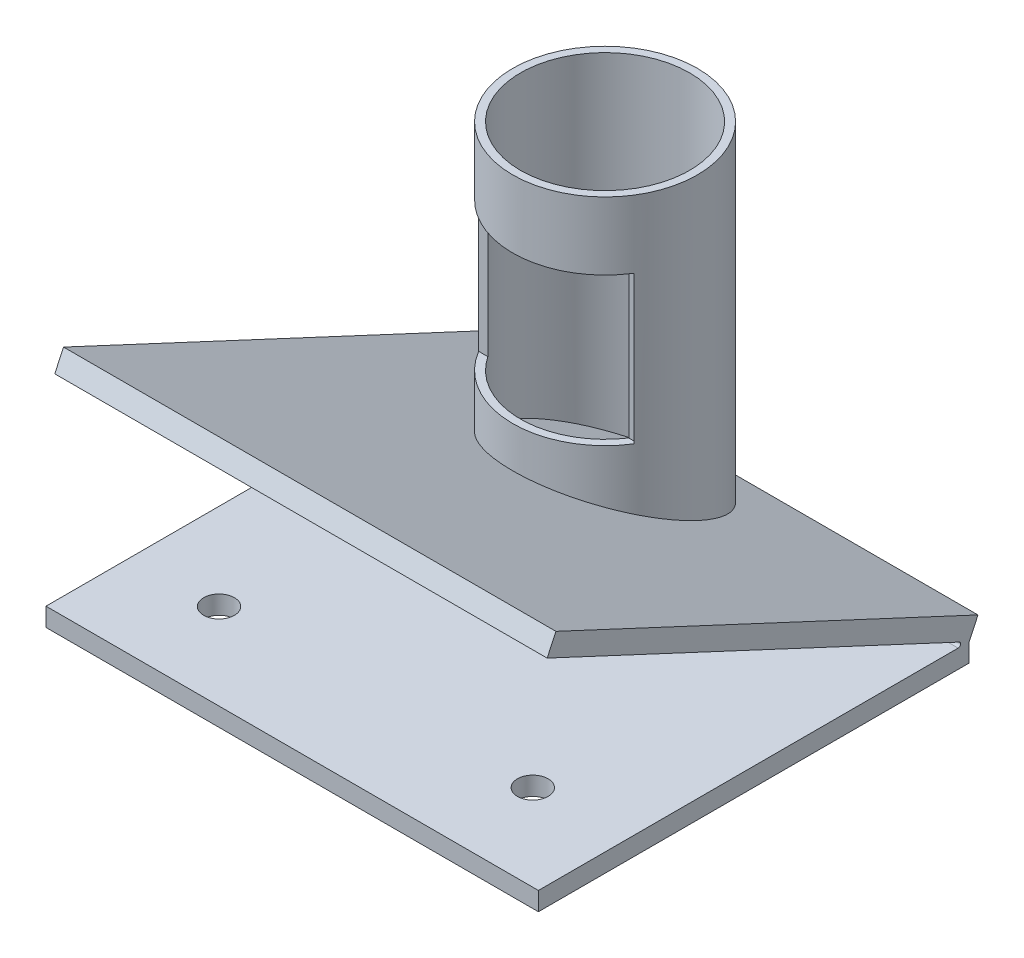
ISO-10303-21;
HEADER;
FILE_DESCRIPTION(('STEP AP214'),'2;1');
FILE_NAME('part.step','',(''),(''),'','','');
FILE_SCHEMA(('AUTOMOTIVE_DESIGN { 1 0 10303 214 1 1 1 1 }'));
ENDSEC;
DATA;
#1=APPLICATION_CONTEXT('core data for automotive mechanical design processes');
#2=APPLICATION_PROTOCOL_DEFINITION('international standard','automotive_design',2000,#1);
#3=PRODUCT_CONTEXT('',#1,'mechanical');
#4=PRODUCT('Part','Part','',(#3));
#5=PRODUCT_RELATED_PRODUCT_CATEGORY('part','',(#4));
#6=PRODUCT_DEFINITION_FORMATION('','',#4);
#7=PRODUCT_DEFINITION_CONTEXT('part definition',#1,'design');
#8=PRODUCT_DEFINITION('design','',#6,#7);
#9=PRODUCT_DEFINITION_SHAPE('','',#8);
#10=(LENGTH_UNIT() NAMED_UNIT(*) SI_UNIT(.MILLI.,.METRE.));
#11=(NAMED_UNIT(*) PLANE_ANGLE_UNIT() SI_UNIT($,.RADIAN.));
#12=(NAMED_UNIT(*) SI_UNIT($,.STERADIAN.) SOLID_ANGLE_UNIT());
#13=UNCERTAINTY_MEASURE_WITH_UNIT(LENGTH_MEASURE(1.E-05),#10,'distance_accuracy_value','');
#14=(GEOMETRIC_REPRESENTATION_CONTEXT(3) GLOBAL_UNCERTAINTY_ASSIGNED_CONTEXT((#13)) GLOBAL_UNIT_ASSIGNED_CONTEXT((#10,
#11,#12)) REPRESENTATION_CONTEXT('',''));
#15=CARTESIAN_POINT('',(0.,0.,0.));
#16=DIRECTION('',(0.,0.,1.));
#17=DIRECTION('',(1.,0.,0.));
#18=AXIS2_PLACEMENT_3D('',#15,#16,#17);
#19=CARTESIAN_POINT('',(-213.817764775785,307.5,-92.9785829926757));
#20=DIRECTION('',(0.,-1.,0.));
#21=DIRECTION('',(0.,0.,-1.));
#22=AXIS2_PLACEMENT_3D('',#19,#20,#21);
#23=CYLINDRICAL_SURFACE('',#22,68.6899118967803);
#24=CARTESIAN_POINT('',(-213.817764775785,45.7472148832393,-92.9785829926757));
#25=DIRECTION('',(0.,0.906307787036653,-0.422618261740694));
#26=DIRECTION('',(0.,-0.422618261740694,-0.906307787036653));
#27=AXIS2_PLACEMENT_3D('',#24,#25,#26);
#28=ELLIPSE('',#27,75.7909320423861,68.6899118967803);
#29=CARTESIAN_POINT('',(-213.817764775785,13.7165829277791,-161.668494889456));
#30=VERTEX_POINT('',#29);
#31=EDGE_CURVE('E196',#30,#30,#28,.T.);
#32=ORIENTED_EDGE('',*,*,#31,.F.);
#33=EDGE_LOOP('',(#32));
#34=FACE_BOUND('',#33,.T.);
#35=CARTESIAN_POINT('',(-213.817764775785,307.5,-92.9785829926757));
#36=DIRECTION('',(0.,1.,0.));
#37=DIRECTION('',(0.,0.,1.));
#38=AXIS2_PLACEMENT_3D('',#35,#36,#37);
#39=CIRCLE('',#38,68.6899118967803);
#40=CARTESIAN_POINT('',(-213.817764775785,307.5,-24.2886710958954));
#41=VERTEX_POINT('',#40);
#42=EDGE_CURVE('E199',#41,#41,#39,.T.);
#43=ORIENTED_EDGE('',*,*,#42,.T.);
#44=EDGE_LOOP('',(#43));
#45=FACE_BOUND('',#44,.T.);
#46=CARTESIAN_POINT('',(-213.817764775785,252.530541112149,-92.9785829926757));
#47=DIRECTION('',(0.,1.,0.));
#48=DIRECTION('',(0.,0.,1.));
#49=AXIS2_PLACEMENT_3D('',#46,#47,#48);
#50=CIRCLE('',#49,68.6899118967803);
#51=CARTESIAN_POINT('',(-271.053516105315,252.530541112149,-55.));
#52=VERTEX_POINT('',#51);
#53=CARTESIAN_POINT('',(-156.582013446254,252.530541112149,-55.));
#54=VERTEX_POINT('',#53);
#55=EDGE_CURVE('E115',#52,#54,#50,.T.);
#56=ORIENTED_EDGE('',*,*,#55,.F.);
#57=DIRECTION('',(0.,-1.,0.));
#58=VECTOR('',#57,1.);
#59=CARTESIAN_POINT('',(-271.053516105315,307.5,-55.));
#60=LINE('',#59,#58);
#61=CARTESIAN_POINT('',(-271.053516105315,132.530541112149,-55.));
#62=VERTEX_POINT('',#61);
#63=EDGE_CURVE('E55',#52,#62,#60,.T.);
#64=ORIENTED_EDGE('',*,*,#63,.T.);
#65=CARTESIAN_POINT('',(-213.817764775785,132.530541112149,-92.9785829926757));
#66=DIRECTION('',(0.,-1.,0.));
#67=DIRECTION('',(1.,0.,0.));
#68=AXIS2_PLACEMENT_3D('',#65,#66,#67);
#69=CIRCLE('',#68,68.6899118967803);
#70=CARTESIAN_POINT('',(-156.582013446254,132.530541112149,-55.));
#71=VERTEX_POINT('',#70);
#72=EDGE_CURVE('E185',#71,#62,#69,.T.);
#73=ORIENTED_EDGE('',*,*,#72,.F.);
#74=DIRECTION('',(0.,-1.,0.));
#75=VECTOR('',#74,1.);
#76=CARTESIAN_POINT('',(-156.582013446254,307.5,-55.));
#77=LINE('',#76,#75);
#78=EDGE_CURVE('E188',#71,#54,#77,.F.);
#79=ORIENTED_EDGE('',*,*,#78,.T.);
#80=EDGE_LOOP('',(#56,#64,#73,#79));
#81=FACE_BOUND('',#80,.T.);
#82=ADVANCED_FACE('F46',(#34,#45,#81),#23,.F.);
#83=CARTESIAN_POINT('',(-213.817764775785,307.5,-92.9785829926757));
#84=DIRECTION('',(0.,1.,0.));
#85=DIRECTION('',(0.,0.,1.));
#86=AXIS2_PLACEMENT_3D('',#83,#84,#85);
#87=PLANE('',#86);
#88=CARTESIAN_POINT('',(-213.817764775785,307.5,-92.9785829926757));
#89=DIRECTION('',(0.,1.,0.));
#90=DIRECTION('',(0.,0.,1.));
#91=AXIS2_PLACEMENT_3D('',#88,#89,#90);
#92=CIRCLE('',#91,75.);
#93=CARTESIAN_POINT('',(-213.817764775785,307.5,-17.9785829926757));
#94=VERTEX_POINT('',#93);
#95=EDGE_CURVE('E133',#94,#94,#92,.T.);
#96=ORIENTED_EDGE('',*,*,#95,.T.);
#97=EDGE_LOOP('',(#96));
#98=FACE_BOUND('',#97,.T.);
#99=ORIENTED_EDGE('',*,*,#42,.F.);
#100=EDGE_LOOP('',(#99));
#101=FACE_BOUND('',#100,.T.);
#102=ADVANCED_FACE('F153',(#98,#101),#87,.T.);
#103=CARTESIAN_POINT('',(-213.817764775785,307.5,-92.9785829926757));
#104=DIRECTION('',(0.,-1.,0.));
#105=DIRECTION('',(0.,0.,-1.));
#106=AXIS2_PLACEMENT_3D('',#103,#104,#105);
#107=CYLINDRICAL_SURFACE('',#106,75.);
#108=CARTESIAN_POINT('',(-213.817764775785,252.530541112149,-92.9785829926757));
#109=DIRECTION('',(0.,1.,0.));
#110=DIRECTION('',(0.,0.,1.));
#111=AXIS2_PLACEMENT_3D('',#108,#109,#110);
#112=CIRCLE('',#111,75.);
#113=CARTESIAN_POINT('',(-278.490999068407,252.530541112149,-55.));
#114=VERTEX_POINT('',#113);
#115=CARTESIAN_POINT('',(-150.376973110227,252.530541112149,-52.9752587202188));
#116=VERTEX_POINT('',#115);
#117=EDGE_CURVE('E128',#114,#116,#112,.T.);
#118=ORIENTED_EDGE('',*,*,#117,.T.);
#119=DIRECTION('',(0.,-1.,0.));
#120=VECTOR('',#119,1.);
#121=CARTESIAN_POINT('',(-150.376973110227,307.5,-52.9752587202188));
#122=LINE('',#121,#120);
#123=CARTESIAN_POINT('',(-150.376973110227,132.530541112149,-52.9752587202188));
#124=VERTEX_POINT('',#123);
#125=EDGE_CURVE('E12',#116,#124,#122,.T.);
#126=ORIENTED_EDGE('',*,*,#125,.T.);
#127=CARTESIAN_POINT('',(-213.817764775785,132.530541112149,-92.9785829926757));
#128=DIRECTION('',(0.,-1.,0.));
#129=DIRECTION('',(1.,0.,0.));
#130=AXIS2_PLACEMENT_3D('',#127,#128,#129);
#131=CIRCLE('',#130,75.);
#132=CARTESIAN_POINT('',(-278.490999068407,132.530541112149,-55.));
#133=VERTEX_POINT('',#132);
#134=EDGE_CURVE('E130',#124,#133,#131,.T.);
#135=ORIENTED_EDGE('',*,*,#134,.T.);
#136=DIRECTION('',(0.,-1.,0.));
#137=VECTOR('',#136,1.);
#138=CARTESIAN_POINT('',(-278.490999068407,307.5,-55.));
#139=LINE('',#138,#137);
#140=EDGE_CURVE('E125',#114,#133,#139,.T.);
#141=ORIENTED_EDGE('',*,*,#140,.F.);
#142=EDGE_LOOP('',(#118,#126,#135,#141));
#143=FACE_BOUND('',#142,.T.);
#144=CARTESIAN_POINT('',(-213.817764775785,45.7472148832393,-92.9785829926757));
#145=DIRECTION('',(0.,0.906307787036653,-0.422618261740694));
#146=DIRECTION('',(0.,-0.422618261740694,-0.906307787036653));
#147=AXIS2_PLACEMENT_3D('',#144,#145,#146);
#148=ELLIPSE('',#147,82.7533439221867,75.);
#149=CARTESIAN_POINT('',(-226.928105838896,11.3126155740734,-166.823819516157));
#150=VERTEX_POINT('',#149);
#151=CARTESIAN_POINT('',(-200.707423712673,11.3126155740734,-166.823819516157));
#152=VERTEX_POINT('',#151);
#153=EDGE_CURVE('E142',#150,#152,#148,.T.);
#154=ORIENTED_EDGE('',*,*,#153,.T.);
#155=CARTESIAN_POINT('',(-200.707423712673,11.3126155740734,-166.823819516157));
#156=CARTESIAN_POINT('',(-201.034810761962,11.2855005766562,-166.881943196528));
#157=CARTESIAN_POINT('',(-201.362383887697,11.2560379603861,-166.937854095449));
#158=CARTESIAN_POINT('',(-202.017832031343,11.1929554458205,-167.045254753267));
#159=CARTESIAN_POINT('',(-202.345707026693,11.159335836559,-167.096744819121));
#160=CARTESIAN_POINT('',(-203.329834134092,11.0530328100565,-167.244615037223));
#161=CARTESIAN_POINT('',(-203.986502110046,10.9749126182362,-167.334379904693));
#162=CARTESIAN_POINT('',(-205.402367043168,10.7947026052441,-167.508883153539));
#163=CARTESIAN_POINT('',(-206.161689645049,10.6907743051416,-167.590689114232));
#164=CARTESIAN_POINT('',(-207.681015695314,10.4725672055995,-167.730990730009));
#165=CARTESIAN_POINT('',(-208.441019207956,10.3582872978499,-167.789483885445));
#166=CARTESIAN_POINT('',(-210.721517384188,10.0055614438785,-167.930120548507));
#167=CARTESIAN_POINT('',(-212.242875713229,9.75717768524431,-167.977467470962));
#168=CARTESIAN_POINT('',(-213.781727349757,9.50588487322255,-167.978576498046));
#169=CARTESIAN_POINT('',(-213.79974610105,9.50294242321852,-167.97858299147));
#170=CARTESIAN_POINT('',(-213.817764775785,9.5,-167.978582992676));
#171=B_SPLINE_CURVE_WITH_KNOTS('',3,(#155,#156,#157,#158,#159,#160,#161,#162,#163,#164,#165,
#166,#167,#168,#169,#170),.UNSPECIFIED.,.F.,.F.,(4,2,2,2,2,2,2,4),(0.,1.00079541527589,
2.00152128475089,4.00323662919698,6.31501761095514,8.62704640013276,13.2499587533103,
13.3047310125252),.UNSPECIFIED.);
#172=CARTESIAN_POINT('',(-213.817764775785,9.5,-167.978582992676));
#173=VERTEX_POINT('',#172);
#174=EDGE_CURVE('E134',#152,#173,#171,.T.);
#175=ORIENTED_EDGE('',*,*,#174,.T.);
#176=CARTESIAN_POINT('',(-226.928105838896,11.3126155740734,-166.823819516157));
#177=CARTESIAN_POINT('',(-226.600718789607,11.2855005766562,-166.881943196528));
#178=CARTESIAN_POINT('',(-226.273145663872,11.2560379603861,-166.937854095449));
#179=CARTESIAN_POINT('',(-225.617697520226,11.1929554458205,-167.045254753267));
#180=CARTESIAN_POINT('',(-225.289822524876,11.159335836559,-167.096744819121));
#181=CARTESIAN_POINT('',(-224.305695417477,11.0530328100565,-167.244615037223));
#182=CARTESIAN_POINT('',(-223.649027441523,10.9749126182362,-167.334379904693));
#183=CARTESIAN_POINT('',(-222.233162508401,10.7947026052441,-167.508883153539));
#184=CARTESIAN_POINT('',(-221.47383990652,10.6907743051416,-167.590689114232));
#185=CARTESIAN_POINT('',(-219.954513856255,10.4725672055995,-167.730990730009));
#186=CARTESIAN_POINT('',(-219.194510343613,10.3582872978499,-167.789483885445));
#187=CARTESIAN_POINT('',(-216.914012167381,10.0055614438785,-167.930120548507));
#188=CARTESIAN_POINT('',(-215.39265383834,9.75717768524431,-167.977467470962));
#189=CARTESIAN_POINT('',(-213.853802201812,9.50588487322255,-167.978576498046));
#190=CARTESIAN_POINT('',(-213.835783450519,9.50294242321852,-167.97858299147));
#191=CARTESIAN_POINT('',(-213.817764775785,9.5,-167.978582992676));
#192=B_SPLINE_CURVE_WITH_KNOTS('',3,(#176,#177,#178,#179,#180,#181,#182,#183,#184,#185,#186,
#187,#188,#189,#190,#191),.UNSPECIFIED.,.F.,.F.,(4,2,2,2,2,2,2,4),(0.,1.00079541527589,
2.00152128475089,4.00323662919698,6.31501761095514,8.62704640013276,13.2499587533103,
13.3047310125252),.UNSPECIFIED.);
#193=EDGE_CURVE('E141',#173,#150,#192,.F.);
#194=ORIENTED_EDGE('',*,*,#193,.T.);
#195=EDGE_LOOP('',(#154,#175,#194));
#196=FACE_BOUND('',#195,.T.);
#197=ORIENTED_EDGE('',*,*,#95,.F.);
#198=EDGE_LOOP('',(#197));
#199=FACE_BOUND('',#198,.T.);
#200=ADVANCED_FACE('F148',(#143,#196,#199),#107,.T.);
#201=CARTESIAN_POINT('',(100.,89.3490554739686,0.525865901099515));
#202=DIRECTION('',(0.,0.906307787036653,-0.422618261740694));
#203=DIRECTION('',(0.,0.422618261740694,0.906307787036653));
#204=AXIS2_PLACEMENT_3D('',#201,#202,#203);
#205=PLANE('',#204);
#206=ORIENTED_EDGE('',*,*,#31,.T.);
#207=EDGE_LOOP('',(#206));
#208=FACE_BOUND('',#207,.T.);
#209=DIRECTION('',(-1.,0.,0.));
#210=VECTOR('',#209,1.);
#211=CARTESIAN_POINT('',(100.,11.3126155740734,-166.823819516157));
#212=LINE('',#211,#210);
#213=EDGE_CURVE('E191',#152,#150,#212,.T.);
#214=ORIENTED_EDGE('',*,*,#213,.F.);
#215=ORIENTED_EDGE('',*,*,#153,.F.);
#216=EDGE_LOOP('',(#214,#215));
#217=FACE_BOUND('',#216,.T.);
#218=ADVANCED_FACE('F152',(#208,#217),#205,.F.);
#219=CARTESIAN_POINT('',(100.,9.5,-165.978582992676));
#220=DIRECTION('',(-1.,0.,0.));
#221=DIRECTION('',(0.,0.,1.));
#222=AXIS2_PLACEMENT_3D('',#219,#220,#221);
#223=CYLINDRICAL_SURFACE('',#222,2.);
#224=ORIENTED_EDGE('',*,*,#213,.T.);
#225=ORIENTED_EDGE('',*,*,#193,.F.);
#226=ORIENTED_EDGE('',*,*,#174,.F.);
#227=EDGE_LOOP('',(#224,#225,#226));
#228=FACE_BOUND('',#227,.T.);
#229=ADVANCED_FACE('F48',(#228),#223,.F.);
#230=CARTESIAN_POINT('',(-150.376973110227,252.530541112149,-55.));
#231=DIRECTION('',(1.,0.,0.));
#232=DIRECTION('',(0.,0.,-1.));
#233=AXIS2_PLACEMENT_3D('',#230,#231,#232);
#234=PLANE('',#233);
#235=DIRECTION('',(0.,0.,1.));
#236=VECTOR('',#235,1.);
#237=CARTESIAN_POINT('',(-150.376973110227,252.530541112149,-55.));
#238=LINE('',#237,#236);
#239=CARTESIAN_POINT('',(-150.376973110227,252.530541112149,-55.));
#240=VERTEX_POINT('',#239);
#241=EDGE_CURVE('E104',#240,#116,#238,.T.);
#242=ORIENTED_EDGE('',*,*,#241,.F.);
#243=DIRECTION('',(0.,1.,0.));
#244=VECTOR('',#243,1.);
#245=CARTESIAN_POINT('',(-150.376973110227,252.530541112149,-55.));
#246=LINE('',#245,#244);
#247=CARTESIAN_POINT('',(-150.376973110227,132.530541112149,-55.));
#248=VERTEX_POINT('',#247);
#249=EDGE_CURVE('E107',#248,#240,#246,.T.);
#250=ORIENTED_EDGE('',*,*,#249,.F.);
#251=DIRECTION('',(0.,0.,1.));
#252=VECTOR('',#251,1.);
#253=CARTESIAN_POINT('',(-150.376973110227,132.530541112149,-55.));
#254=LINE('',#253,#252);
#255=EDGE_CURVE('E110',#248,#124,#254,.T.);
#256=ORIENTED_EDGE('',*,*,#255,.T.);
#257=ORIENTED_EDGE('',*,*,#125,.F.);
#258=EDGE_LOOP('',(#242,#250,#256,#257));
#259=FACE_BOUND('',#258,.T.);
#260=ADVANCED_FACE('F105',(#259),#234,.F.);
#261=CARTESIAN_POINT('',(-280.376973110227,132.530541112149,-55.));
#262=DIRECTION('',(0.,-1.,0.));
#263=DIRECTION('',(1.,0.,0.));
#264=AXIS2_PLACEMENT_3D('',#261,#262,#263);
#265=PLANE('',#264);
#266=ORIENTED_EDGE('',*,*,#255,.F.);
#267=DIRECTION('',(1.,0.,0.));
#268=VECTOR('',#267,1.);
#269=CARTESIAN_POINT('',(-280.376973110227,132.530541112149,-55.));
#270=LINE('',#269,#268);
#271=EDGE_CURVE('E117',#71,#248,#270,.T.);
#272=ORIENTED_EDGE('',*,*,#271,.F.);
#273=ORIENTED_EDGE('',*,*,#72,.T.);
#274=EDGE_CURVE('E111',#133,#62,#270,.T.);
#275=ORIENTED_EDGE('',*,*,#274,.F.);
#276=ORIENTED_EDGE('',*,*,#134,.F.);
#277=EDGE_LOOP('',(#266,#272,#273,#275,#276));
#278=FACE_BOUND('',#277,.T.);
#279=ADVANCED_FACE('F167',(#278),#265,.F.);
#280=CARTESIAN_POINT('',(-280.376973110227,252.530541112149,-55.));
#281=DIRECTION('',(0.,1.,0.));
#282=DIRECTION('',(0.,0.,1.));
#283=AXIS2_PLACEMENT_3D('',#280,#281,#282);
#284=PLANE('',#283);
#285=DIRECTION('',(-1.,0.,0.));
#286=VECTOR('',#285,1.);
#287=CARTESIAN_POINT('',(-280.376973110227,252.530541112149,-55.));
#288=LINE('',#287,#286);
#289=EDGE_CURVE('E62',#52,#114,#288,.T.);
#290=ORIENTED_EDGE('',*,*,#289,.F.);
#291=ORIENTED_EDGE('',*,*,#55,.T.);
#292=EDGE_CURVE('E70',#240,#54,#288,.T.);
#293=ORIENTED_EDGE('',*,*,#292,.F.);
#294=ORIENTED_EDGE('',*,*,#241,.T.);
#295=ORIENTED_EDGE('',*,*,#117,.F.);
#296=EDGE_LOOP('',(#290,#291,#293,#294,#295));
#297=FACE_BOUND('',#296,.T.);
#298=ADVANCED_FACE('F113',(#297),#284,.F.);
#299=CARTESIAN_POINT('',(0.,0.,-55.));
#300=DIRECTION('',(0.,0.,1.));
#301=DIRECTION('',(1.,0.,0.));
#302=AXIS2_PLACEMENT_3D('',#299,#300,#301);
#303=PLANE('',#302);
#304=ORIENTED_EDGE('',*,*,#140,.T.);
#305=ORIENTED_EDGE('',*,*,#274,.T.);
#306=ORIENTED_EDGE('',*,*,#63,.F.);
#307=ORIENTED_EDGE('',*,*,#289,.T.);
#308=EDGE_LOOP('',(#304,#305,#306,#307));
#309=FACE_BOUND('',#308,.T.);
#310=ADVANCED_FACE('F170',(#309),#303,.T.);
#311=ORIENTED_EDGE('',*,*,#271,.T.);
#312=ORIENTED_EDGE('',*,*,#249,.T.);
#313=ORIENTED_EDGE('',*,*,#292,.T.);
#314=ORIENTED_EDGE('',*,*,#78,.F.);
#315=EDGE_LOOP('',(#311,#312,#313,#314));
#316=FACE_BOUND('',#315,.T.);
#317=ADVANCED_FACE('F119',(#316),#303,.T.);
#318=CLOSED_SHELL('',(#82,#102,#200,#218,#229,#260,#279,#298,#310,#317));
#319=MANIFOLD_SOLID_BREP('B2',#318);
#320=CARTESIAN_POINT('',(-213.817764775785,307.5,-92.9785829926757));
#321=DIRECTION('',(0.,-1.,0.));
#322=DIRECTION('',(0.,0.,-1.));
#323=AXIS2_PLACEMENT_3D('',#320,#321,#322);
#324=CYLINDRICAL_SURFACE('',#323,75.);
#325=CARTESIAN_POINT('',(-213.817764775785,7.5,-92.9785829926757));
#326=DIRECTION('',(0.,1.,0.));
#327=DIRECTION('',(0.,0.,1.));
#328=AXIS2_PLACEMENT_3D('',#325,#326,#327);
#329=CIRCLE('',#328,75.);
#330=CARTESIAN_POINT('',(-196.613114241699,7.5,-165.978582992676));
#331=VERTEX_POINT('',#330);
#332=CARTESIAN_POINT('',(-231.02241530987,7.5,-165.978582992676));
#333=VERTEX_POINT('',#332);
#334=EDGE_CURVE('E314',#331,#333,#329,.T.);
#335=ORIENTED_EDGE('',*,*,#334,.T.);
#336=CARTESIAN_POINT('',(-231.02241530987,7.5,-165.978582992676));
#337=CARTESIAN_POINT('',(-230.859871610319,7.5000030779696,-166.016891387124));
#338=CARTESIAN_POINT('',(-230.697203538166,7.50110029903577,-166.05465589988));
#339=CARTESIAN_POINT('',(-230.371647757055,7.50532222698744,-166.129091106795));
#340=CARTESIAN_POINT('',(-230.208760053971,7.50844688067743,-166.165761829625));
#341=CARTESIAN_POINT('',(-229.719863791152,7.52061926623831,-166.274112701136));
#342=CARTESIAN_POINT('',(-229.393556800832,7.53246555307243,-166.344146936632));
#343=CARTESIAN_POINT('',(-228.740426512773,7.56257192898389,-166.479776070624));
#344=CARTESIAN_POINT('',(-228.413603393691,7.58083014356122,-166.545372259887));
#345=CARTESIAN_POINT('',(-227.759454465751,7.6229179966989,-166.672139637315));
#346=CARTESIAN_POINT('',(-227.432128643257,7.64674778912573,-166.733310703213));
#347=CARTESIAN_POINT('',(-226.555807297543,7.71699537581744,-166.891052739895));
#348=CARTESIAN_POINT('',(-226.006437457866,7.76779761985533,-166.983622964494));
#349=CARTESIAN_POINT('',(-224.906861220114,7.88028705973833,-167.156353982526));
#350=CARTESIAN_POINT('',(-224.356654780619,7.9419748131556,-167.236514139901));
#351=CARTESIAN_POINT('',(-223.255432886828,8.0740747855066,-167.38449118064));
#352=CARTESIAN_POINT('',(-222.704417214212,8.14449010342456,-167.452303658365));
#353=CARTESIAN_POINT('',(-221.601921081291,8.29219476671178,-167.575597670393));
#354=CARTESIAN_POINT('',(-221.050440602726,8.36948439593494,-167.631078695176));
#355=CARTESIAN_POINT('',(-219.395003667898,8.60929723212466,-167.77913494735));
#356=CARTESIAN_POINT('',(-218.290500329492,8.77970786925848,-167.853263166343));
#357=CARTESIAN_POINT('',(-216.081228128223,9.13045437181549,-167.952571896956));
#358=CARTESIAN_POINT('',(-214.976459451026,9.3107871735873,-167.977767431194));
#359=CARTESIAN_POINT('',(-213.853802241223,9.49411510777885,-167.978576497769));
#360=CARTESIAN_POINT('',(-213.835783490237,9.49705755758565,-167.978582991202));
#361=CARTESIAN_POINT('',(-213.817764775785,9.5,-167.978582992676));
#362=B_SPLINE_CURVE_WITH_KNOTS('',3,(#336,#337,#338,#339,#340,#341,#342,#343,#344,#345,#346,
#347,#348,#349,#350,#351,#352,#353,#354,#355,#356,#357,#358,#359,#360,#361),.UNSPECIFIED.,.F.,
.F.,(4,2,2,2,2,2,2,2,2,2,2,2,4),(0.,0.500980196632241,1.0019472491417,2.00368022368171,
3.00512058927106,4.00658861422741,5.68456968460019,7.36263672864905,9.04130133711228,
10.7200352931641,14.0788701721253,17.4366737061747,17.4914459653973),.UNSPECIFIED.);
#363=CARTESIAN_POINT('',(-213.817764775785,9.5,-167.978582992676));
#364=VERTEX_POINT('',#363);
#365=EDGE_CURVE('E44',#333,#364,#362,.T.);
#366=ORIENTED_EDGE('',*,*,#365,.T.);
#367=CARTESIAN_POINT('',(-196.613114241699,7.5,-165.978582992676));
#368=CARTESIAN_POINT('',(-196.775657941251,7.5000030779696,-166.016891387124));
#369=CARTESIAN_POINT('',(-196.938326013403,7.50110029903577,-166.05465589988));
#370=CARTESIAN_POINT('',(-197.263881794514,7.50532222698744,-166.129091106795));
#371=CARTESIAN_POINT('',(-197.426769497598,7.50844688067743,-166.165761829625));
#372=CARTESIAN_POINT('',(-197.915665760417,7.52061926623831,-166.274112701136));
#373=CARTESIAN_POINT('',(-198.241972750738,7.53246555307243,-166.344146936632));
#374=CARTESIAN_POINT('',(-198.895103038796,7.56257192898389,-166.479776070624));
#375=CARTESIAN_POINT('',(-199.221926157878,7.58083014356122,-166.545372259887));
#376=CARTESIAN_POINT('',(-199.876075085818,7.6229179966989,-166.672139637315));
#377=CARTESIAN_POINT('',(-200.203400908312,7.64674778912573,-166.733310703213));
#378=CARTESIAN_POINT('',(-201.079722254026,7.71699537581744,-166.891052739895));
#379=CARTESIAN_POINT('',(-201.629092093703,7.76779761985532,-166.983622964494));
#380=CARTESIAN_POINT('',(-202.728668331455,7.88028705973831,-167.156353982526));
#381=CARTESIAN_POINT('',(-203.27887477095,7.94197481315559,-167.236514139901));
#382=CARTESIAN_POINT('',(-204.380096664741,8.07407478550659,-167.38449118064));
#383=CARTESIAN_POINT('',(-204.931112337357,8.14449010342455,-167.452303658365));
#384=CARTESIAN_POINT('',(-206.033608470277,8.29219476671177,-167.575597670393));
#385=CARTESIAN_POINT('',(-206.585088948842,8.36948439593492,-167.631078695176));
#386=CARTESIAN_POINT('',(-208.240525883671,8.60929723212464,-167.77913494735));
#387=CARTESIAN_POINT('',(-209.345029222077,8.77970786925847,-167.853263166343));
#388=CARTESIAN_POINT('',(-211.554301423346,9.1304543718155,-167.952571896956));
#389=CARTESIAN_POINT('',(-212.659070100543,9.3107871735873,-167.977767431194));
#390=CARTESIAN_POINT('',(-213.781727310346,9.49411510777885,-167.978576497769));
#391=CARTESIAN_POINT('',(-213.799746061333,9.49705755758565,-167.978582991202));
#392=CARTESIAN_POINT('',(-213.817764775785,9.5,-167.978582992676));
#393=B_SPLINE_CURVE_WITH_KNOTS('',3,(#367,#368,#369,#370,#371,#372,#373,#374,#375,#376,#377,
#378,#379,#380,#381,#382,#383,#384,#385,#386,#387,#388,#389,#390,#391,#392),.UNSPECIFIED.,.F.,
.F.,(4,2,2,2,2,2,2,2,2,2,2,2,4),(0.,0.500980196632241,1.0019472491417,2.00368022368171,
3.00512058927106,4.00658861422741,5.68456968460013,7.36263672864894,9.04130133711217,
10.720035293164,14.0788701721253,17.4366737061747,17.4914459653973),.UNSPECIFIED.);
#394=EDGE_CURVE('E297',#364,#331,#393,.F.);
#395=ORIENTED_EDGE('',*,*,#394,.T.);
#396=EDGE_LOOP('',(#335,#366,#395));
#397=FACE_BOUND('',#396,.T.);
#398=ADVANCED_FACE('F284',(#397),#324,.T.);
#399=CARTESIAN_POINT('',(-213.817764775785,7.5,-92.9785829926757));
#400=DIRECTION('',(0.,1.,0.));
#401=DIRECTION('',(0.,0.,1.));
#402=AXIS2_PLACEMENT_3D('',#399,#400,#401);
#403=PLANE('',#402);
#404=ORIENTED_EDGE('',*,*,#334,.F.);
#405=DIRECTION('',(-1.,0.,0.));
#406=VECTOR('',#405,1.);
#407=CARTESIAN_POINT('',(100.,7.5,-165.978582992676));
#408=LINE('',#407,#406);
#409=EDGE_CURVE('E306',#331,#333,#408,.T.);
#410=ORIENTED_EDGE('',*,*,#409,.T.);
#411=EDGE_LOOP('',(#404,#410));
#412=FACE_BOUND('',#411,.T.);
#413=ADVANCED_FACE('F313',(#412),#403,.F.);
#414=CARTESIAN_POINT('',(100.,9.5,-165.978582992676));
#415=DIRECTION('',(-1.,0.,0.));
#416=DIRECTION('',(0.,0.,1.));
#417=AXIS2_PLACEMENT_3D('',#414,#415,#416);
#418=CYLINDRICAL_SURFACE('',#417,2.);
#419=ORIENTED_EDGE('',*,*,#409,.F.);
#420=ORIENTED_EDGE('',*,*,#394,.F.);
#421=ORIENTED_EDGE('',*,*,#365,.F.);
#422=EDGE_LOOP('',(#419,#420,#421));
#423=FACE_BOUND('',#422,.T.);
#424=ADVANCED_FACE('F308',(#423),#418,.F.);
#425=CLOSED_SHELL('',(#398,#413,#424));
#426=MANIFOLD_SOLID_BREP('B6',#425);
#427=CARTESIAN_POINT('',(-400.,7.5,-175.));
#428=DIRECTION('',(0.,0.,-1.));
#429=DIRECTION('',(-1.,0.,0.));
#430=AXIS2_PLACEMENT_3D('',#427,#428,#429);
#431=PLANE('',#430);
#432=DIRECTION('',(0.,1.,0.));
#433=VECTOR('',#432,1.);
#434=CARTESIAN_POINT('',(0.,7.5,-175.));
#435=LINE('',#434,#433);
#436=CARTESIAN_POINT('',(0.,-7.5,-175.));
#437=VERTEX_POINT('',#436);
#438=CARTESIAN_POINT('',(0.,7.5,-175.));
#439=VERTEX_POINT('',#438);
#440=EDGE_CURVE('E451',#437,#439,#435,.T.);
#441=ORIENTED_EDGE('',*,*,#440,.F.);
#442=DIRECTION('',(1.,0.,0.));
#443=VECTOR('',#442,1.);
#444=CARTESIAN_POINT('',(-400.,-7.5,-175.));
#445=LINE('',#444,#443);
#446=CARTESIAN_POINT('',(-400.,-7.5,-175.));
#447=VERTEX_POINT('',#446);
#448=EDGE_CURVE('E282',#447,#437,#445,.T.);
#449=ORIENTED_EDGE('',*,*,#448,.F.);
#450=DIRECTION('',(0.,1.,0.));
#451=VECTOR('',#450,1.);
#452=CARTESIAN_POINT('',(-400.,7.5,-175.));
#453=LINE('',#452,#451);
#454=CARTESIAN_POINT('',(-400.,7.5,-175.));
#455=VERTEX_POINT('',#454);
#456=EDGE_CURVE('E474',#447,#455,#453,.T.);
#457=ORIENTED_EDGE('',*,*,#456,.T.);
#458=DIRECTION('',(1.,0.,0.));
#459=VECTOR('',#458,1.);
#460=CARTESIAN_POINT('',(-400.,7.5,-175.));
#461=LINE('',#460,#459);
#462=EDGE_CURVE('E407',#455,#439,#461,.T.);
#463=ORIENTED_EDGE('',*,*,#462,.T.);
#464=EDGE_LOOP('',(#441,#449,#457,#463));
#465=FACE_BOUND('',#464,.T.);
#466=ADVANCED_FACE('F348',(#465),#431,.T.);
#467=CARTESIAN_POINT('',(-400.,-7.5,175.));
#468=DIRECTION('',(0.,-1.,0.));
#469=DIRECTION('',(0.,0.,-1.));
#470=AXIS2_PLACEMENT_3D('',#467,#468,#469);
#471=PLANE('',#470);
#472=CARTESIAN_POINT('',(-329.477573639759,-7.5,104.932817602376));
#473=DIRECTION('',(0.,-1.,0.));
#474=DIRECTION('',(0.,0.,-1.));
#475=AXIS2_PLACEMENT_3D('',#472,#473,#474);
#476=CIRCLE('',#475,12.4623911417746);
#477=CARTESIAN_POINT('',(-329.477573639759,-7.5,92.4704264606013));
#478=VERTEX_POINT('',#477);
#479=EDGE_CURVE('E489',#478,#478,#476,.T.);
#480=ORIENTED_EDGE('',*,*,#479,.F.);
#481=EDGE_LOOP('',(#480));
#482=FACE_BOUND('',#481,.T.);
#483=CARTESIAN_POINT('',(-74.6165788863995,-7.5,104.932817602376));
#484=DIRECTION('',(0.,-1.,0.));
#485=DIRECTION('',(0.,0.,-1.));
#486=AXIS2_PLACEMENT_3D('',#483,#484,#485);
#487=CIRCLE('',#486,12.4623911417746);
#488=CARTESIAN_POINT('',(-74.6165788863995,-7.5,92.4704264606012));
#489=VERTEX_POINT('',#488);
#490=EDGE_CURVE('E495',#489,#489,#487,.T.);
#491=ORIENTED_EDGE('',*,*,#490,.F.);
#492=EDGE_LOOP('',(#491));
#493=FACE_BOUND('',#492,.T.);
#494=CARTESIAN_POINT('',(-200.,-7.5,0.));
#495=DIRECTION('',(0.,-1.,0.));
#496=DIRECTION('',(0.,0.,-1.));
#497=AXIS2_PLACEMENT_3D('',#494,#495,#496);
#498=CIRCLE('',#497,30.);
#499=CARTESIAN_POINT('',(-200.,-7.5,-30.));
#500=VERTEX_POINT('',#499);
#501=EDGE_CURVE('E493',#500,#500,#498,.T.);
#502=ORIENTED_EDGE('',*,*,#501,.F.);
#503=EDGE_LOOP('',(#502));
#504=FACE_BOUND('',#503,.T.);
#505=DIRECTION('',(0.,0.,-1.));
#506=VECTOR('',#505,1.);
#507=CARTESIAN_POINT('',(0.,-7.5,175.));
#508=LINE('',#507,#506);
#509=CARTESIAN_POINT('',(0.,-7.5,175.));
#510=VERTEX_POINT('',#509);
#511=EDGE_CURVE('E472',#510,#437,#508,.T.);
#512=ORIENTED_EDGE('',*,*,#511,.F.);
#513=DIRECTION('',(1.,0.,0.));
#514=VECTOR('',#513,1.);
#515=CARTESIAN_POINT('',(-400.,-7.5,175.));
#516=LINE('',#515,#514);
#517=CARTESIAN_POINT('',(-400.,-7.5,175.));
#518=VERTEX_POINT('',#517);
#519=EDGE_CURVE('E357',#518,#510,#516,.T.);
#520=ORIENTED_EDGE('',*,*,#519,.F.);
#521=DIRECTION('',(0.,0.,-1.));
#522=VECTOR('',#521,1.);
#523=CARTESIAN_POINT('',(-400.,-7.5,175.));
#524=LINE('',#523,#522);
#525=EDGE_CURVE('E446',#518,#447,#524,.T.);
#526=ORIENTED_EDGE('',*,*,#525,.T.);
#527=ORIENTED_EDGE('',*,*,#448,.T.);
#528=EDGE_LOOP('',(#512,#520,#526,#527));
#529=FACE_BOUND('',#528,.T.);
#530=ADVANCED_FACE('F534',(#482,#493,#504,#529),#471,.T.);
#531=CARTESIAN_POINT('',(-400.,7.5,175.));
#532=DIRECTION('',(0.,0.,1.));
#533=DIRECTION('',(1.,0.,0.));
#534=AXIS2_PLACEMENT_3D('',#531,#532,#533);
#535=PLANE('',#534);
#536=DIRECTION('',(0.,-1.,0.));
#537=VECTOR('',#536,1.);
#538=CARTESIAN_POINT('',(0.,7.5,175.));
#539=LINE('',#538,#537);
#540=CARTESIAN_POINT('',(0.,7.5,175.));
#541=VERTEX_POINT('',#540);
#542=EDGE_CURVE('E443',#541,#510,#539,.T.);
#543=ORIENTED_EDGE('',*,*,#542,.F.);
#544=DIRECTION('',(1.,0.,0.));
#545=VECTOR('',#544,1.);
#546=CARTESIAN_POINT('',(-400.,7.5,175.));
#547=LINE('',#546,#545);
#548=CARTESIAN_POINT('',(-400.,7.5,175.));
#549=VERTEX_POINT('',#548);
#550=EDGE_CURVE('E432',#549,#541,#547,.T.);
#551=ORIENTED_EDGE('',*,*,#550,.F.);
#552=DIRECTION('',(0.,-1.,0.));
#553=VECTOR('',#552,1.);
#554=CARTESIAN_POINT('',(-400.,7.5,175.));
#555=LINE('',#554,#553);
#556=EDGE_CURVE('E438',#549,#518,#555,.T.);
#557=ORIENTED_EDGE('',*,*,#556,.T.);
#558=ORIENTED_EDGE('',*,*,#519,.T.);
#559=EDGE_LOOP('',(#543,#551,#557,#558));
#560=FACE_BOUND('',#559,.T.);
#561=ADVANCED_FACE('F441',(#560),#535,.T.);
#562=CARTESIAN_POINT('',(-400.,7.5,175.));
#563=DIRECTION('',(0.,1.,0.));
#564=DIRECTION('',(0.,0.,1.));
#565=AXIS2_PLACEMENT_3D('',#562,#563,#564);
#566=PLANE('',#565);
#567=ORIENTED_EDGE('',*,*,#550,.T.);
#568=DIRECTION('',(0.,0.,1.));
#569=VECTOR('',#568,1.);
#570=CARTESIAN_POINT('',(0.,7.5,175.));
#571=LINE('',#570,#569);
#572=CARTESIAN_POINT('',(0.,7.5,-165.978582992676));
#573=VERTEX_POINT('',#572);
#574=EDGE_CURVE('E469',#573,#541,#571,.T.);
#575=ORIENTED_EDGE('',*,*,#574,.F.);
#576=DIRECTION('',(1.,0.,0.));
#577=VECTOR('',#576,1.);
#578=CARTESIAN_POINT('',(-400.,7.5,-165.978582992676));
#579=LINE('',#578,#577);
#580=CARTESIAN_POINT('',(-400.,7.5,-165.978582992676));
#581=VERTEX_POINT('',#580);
#582=EDGE_CURVE('E433',#581,#573,#579,.T.);
#583=ORIENTED_EDGE('',*,*,#582,.F.);
#584=DIRECTION('',(0.,0.,1.));
#585=VECTOR('',#584,1.);
#586=CARTESIAN_POINT('',(-400.,7.5,175.));
#587=LINE('',#586,#585);
#588=EDGE_CURVE('E427',#581,#549,#587,.T.);
#589=ORIENTED_EDGE('',*,*,#588,.T.);
#590=EDGE_LOOP('',(#567,#575,#583,#589));
#591=FACE_BOUND('',#590,.T.);
#592=CARTESIAN_POINT('',(-329.477573639759,7.5,104.932817602376));
#593=DIRECTION('',(0.,1.,0.));
#594=DIRECTION('',(0.,0.,1.));
#595=AXIS2_PLACEMENT_3D('',#592,#593,#594);
#596=CIRCLE('',#595,12.4623911417746);
#597=CARTESIAN_POINT('',(-329.477573639759,7.5,117.39520874415));
#598=VERTEX_POINT('',#597);
#599=EDGE_CURVE('E351',#598,#598,#596,.T.);
#600=ORIENTED_EDGE('',*,*,#599,.F.);
#601=EDGE_LOOP('',(#600));
#602=FACE_BOUND('',#601,.T.);
#603=CARTESIAN_POINT('',(-74.6165788863995,7.5,104.932817602376));
#604=DIRECTION('',(0.,1.,0.));
#605=DIRECTION('',(0.,0.,1.));
#606=AXIS2_PLACEMENT_3D('',#603,#604,#605);
#607=CIRCLE('',#606,12.4623911417746);
#608=CARTESIAN_POINT('',(-74.6165788863995,7.5,117.395208744151));
#609=VERTEX_POINT('',#608);
#610=EDGE_CURVE('E487',#609,#609,#607,.T.);
#611=ORIENTED_EDGE('',*,*,#610,.F.);
#612=EDGE_LOOP('',(#611));
#613=FACE_BOUND('',#612,.T.);
#614=ADVANCED_FACE('F429',(#591,#602,#613),#566,.T.);
#615=CARTESIAN_POINT('',(-400.,9.5,-165.978582992676));
#616=DIRECTION('',(1.,0.,0.));
#617=DIRECTION('',(0.,0.,-1.));
#618=AXIS2_PLACEMENT_3D('',#615,#616,#617);
#619=CYLINDRICAL_SURFACE('',#618,2.);
#620=CARTESIAN_POINT('',(0.,9.5,-165.978582992676));
#621=DIRECTION('',(-1.,0.,0.));
#622=DIRECTION('',(0.,0.,-1.));
#623=AXIS2_PLACEMENT_3D('',#620,#621,#622);
#624=CIRCLE('',#623,2.);
#625=CARTESIAN_POINT('',(0.,11.3126155740734,-166.823819516157));
#626=VERTEX_POINT('',#625);
#627=EDGE_CURVE('E466',#626,#573,#624,.T.);
#628=ORIENTED_EDGE('',*,*,#627,.F.);
#629=DIRECTION('',(1.,0.,0.));
#630=VECTOR('',#629,1.);
#631=CARTESIAN_POINT('',(-400.,11.3126155740734,-166.823819516157));
#632=LINE('',#631,#630);
#633=CARTESIAN_POINT('',(-400.,11.3126155740734,-166.823819516157));
#634=VERTEX_POINT('',#633);
#635=EDGE_CURVE('E478',#634,#626,#632,.T.);
#636=ORIENTED_EDGE('',*,*,#635,.F.);
#637=CARTESIAN_POINT('',(-400.,9.5,-165.978582992676));
#638=DIRECTION('',(-1.,0.,0.));
#639=DIRECTION('',(0.,0.,-1.));
#640=AXIS2_PLACEMENT_3D('',#637,#638,#639);
#641=CIRCLE('',#640,2.);
#642=EDGE_CURVE('E439',#634,#581,#641,.T.);
#643=ORIENTED_EDGE('',*,*,#642,.T.);
#644=ORIENTED_EDGE('',*,*,#582,.T.);
#645=EDGE_LOOP('',(#628,#636,#643,#644));
#646=FACE_BOUND('',#645,.T.);
#647=ADVANCED_FACE('F519',(#646),#619,.F.);
#648=CARTESIAN_POINT('',(-400.,11.3126155740734,-166.823819516157));
#649=DIRECTION('',(0.,-0.906307787036653,0.422618261740694));
#650=DIRECTION('',(0.,-0.422618261740694,-0.906307787036653));
#651=AXIS2_PLACEMENT_3D('',#648,#649,#650);
#652=PLANE('',#651);
#653=DIRECTION('',(0.,-0.422618261740694,-0.906307787036653));
#654=VECTOR('',#653,1.);
#655=CARTESIAN_POINT('',(-400.,11.3126155740734,-166.823819516157));
#656=LINE('',#655,#654);
#657=CARTESIAN_POINT('',(-400.,167.385495373864,167.875551318356));
#658=VERTEX_POINT('',#657);
#659=EDGE_CURVE('E515',#658,#634,#656,.T.);
#660=ORIENTED_EDGE('',*,*,#659,.T.);
#661=ORIENTED_EDGE('',*,*,#635,.T.);
#662=DIRECTION('',(0.,-0.422618261740694,-0.906307787036653));
#663=VECTOR('',#662,1.);
#664=CARTESIAN_POINT('',(0.,11.3126155740734,-166.823819516157));
#665=LINE('',#664,#663);
#666=CARTESIAN_POINT('',(0.,167.385495373864,167.875551318356));
#667=VERTEX_POINT('',#666);
#668=EDGE_CURVE('E464',#667,#626,#665,.T.);
#669=ORIENTED_EDGE('',*,*,#668,.F.);
#670=DIRECTION('',(1.,0.,0.));
#671=VECTOR('',#670,1.);
#672=CARTESIAN_POINT('',(-400.,167.385495373864,167.875551318356));
#673=LINE('',#672,#671);
#674=EDGE_CURVE('E481',#658,#667,#673,.T.);
#675=ORIENTED_EDGE('',*,*,#674,.F.);
#676=EDGE_LOOP('',(#660,#661,#669,#675));
#677=FACE_BOUND('',#676,.T.);
#678=ADVANCED_FACE('F551',(#677),#652,.T.);
#679=CARTESIAN_POINT('',(-400.,167.385495373864,167.875551318356));
#680=DIRECTION('',(0.,0.42261826174069,0.906307787036654));
#681=DIRECTION('',(0.,-0.906307787036654,0.42261826174069));
#682=AXIS2_PLACEMENT_3D('',#679,#680,#681);
#683=PLANE('',#682);
#684=DIRECTION('',(0.,-0.906307787036654,0.42261826174069));
#685=VECTOR('',#684,1.);
#686=CARTESIAN_POINT('',(0.,167.385495373864,167.875551318356));
#687=LINE('',#686,#685);
#688=CARTESIAN_POINT('',(0.,182.663924876465,160.751102636712));
#689=VERTEX_POINT('',#688);
#690=EDGE_CURVE('E461',#689,#667,#687,.T.);
#691=ORIENTED_EDGE('',*,*,#690,.F.);
#692=DIRECTION('',(1.,0.,0.));
#693=VECTOR('',#692,1.);
#694=CARTESIAN_POINT('',(-400.,182.663924876465,160.751102636712));
#695=LINE('',#694,#693);
#696=CARTESIAN_POINT('',(-400.,182.663924876465,160.751102636712));
#697=VERTEX_POINT('',#696);
#698=EDGE_CURVE('E483',#697,#689,#695,.T.);
#699=ORIENTED_EDGE('',*,*,#698,.F.);
#700=DIRECTION('',(0.,-0.906307787036654,0.42261826174069));
#701=VECTOR('',#700,1.);
#702=CARTESIAN_POINT('',(-400.,167.385495373864,167.875551318356));
#703=LINE('',#702,#701);
#704=EDGE_CURVE('E512',#697,#658,#703,.T.);
#705=ORIENTED_EDGE('',*,*,#704,.T.);
#706=ORIENTED_EDGE('',*,*,#674,.T.);
#707=EDGE_LOOP('',(#691,#699,#705,#706));
#708=FACE_BOUND('',#707,.T.);
#709=ADVANCED_FACE('F526',(#708),#683,.T.);
#710=CARTESIAN_POINT('',(-400.,22.7784295026011,-182.124448681644));
#711=DIRECTION('',(0.,0.906307787036653,-0.422618261740694));
#712=DIRECTION('',(0.,0.422618261740694,0.906307787036653));
#713=AXIS2_PLACEMENT_3D('',#710,#711,#712);
#714=PLANE('',#713);
#715=DIRECTION('',(0.,0.422618261740694,0.906307787036653));
#716=VECTOR('',#715,1.);
#717=CARTESIAN_POINT('',(0.,22.7784295026011,-182.124448681644));
#718=LINE('',#717,#716);
#719=CARTESIAN_POINT('',(0.,22.7784295026011,-182.124448681644));
#720=VERTEX_POINT('',#719);
#721=EDGE_CURVE('E458',#720,#689,#718,.T.);
#722=ORIENTED_EDGE('',*,*,#721,.F.);
#723=DIRECTION('',(1.,0.,0.));
#724=VECTOR('',#723,1.);
#725=CARTESIAN_POINT('',(-400.,22.7784295026011,-182.124448681644));
#726=LINE('',#725,#724);
#727=CARTESIAN_POINT('',(-400.,22.7784295026011,-182.124448681644));
#728=VERTEX_POINT('',#727);
#729=EDGE_CURVE('E485',#728,#720,#726,.T.);
#730=ORIENTED_EDGE('',*,*,#729,.F.);
#731=DIRECTION('',(0.,0.422618261740694,0.906307787036653));
#732=VECTOR('',#731,1.);
#733=CARTESIAN_POINT('',(-400.,22.7784295026011,-182.124448681644));
#734=LINE('',#733,#732);
#735=EDGE_CURVE('E509',#728,#697,#734,.T.);
#736=ORIENTED_EDGE('',*,*,#735,.T.);
#737=ORIENTED_EDGE('',*,*,#698,.T.);
#738=EDGE_LOOP('',(#722,#730,#736,#737));
#739=FACE_BOUND('',#738,.T.);
#740=ADVANCED_FACE('F530',(#739),#714,.T.);
#741=CARTESIAN_POINT('',(-400.,7.5,-175.));
#742=DIRECTION('',(0.,-0.422618261740694,-0.906307787036653));
#743=DIRECTION('',(0.,0.906307787036653,-0.422618261740694));
#744=AXIS2_PLACEMENT_3D('',#741,#742,#743);
#745=PLANE('',#744);
#746=DIRECTION('',(0.,0.906307787036652,-0.422618261740694));
#747=VECTOR('',#746,1.);
#748=CARTESIAN_POINT('',(0.,7.5,-175.));
#749=LINE('',#748,#747);
#750=EDGE_CURVE('E454',#439,#720,#749,.T.);
#751=ORIENTED_EDGE('',*,*,#750,.F.);
#752=ORIENTED_EDGE('',*,*,#462,.F.);
#753=DIRECTION('',(0.,0.906307787036652,-0.422618261740694));
#754=VECTOR('',#753,1.);
#755=CARTESIAN_POINT('',(-400.,7.5,-175.));
#756=LINE('',#755,#754);
#757=EDGE_CURVE('E507',#455,#728,#756,.T.);
#758=ORIENTED_EDGE('',*,*,#757,.T.);
#759=ORIENTED_EDGE('',*,*,#729,.T.);
#760=EDGE_LOOP('',(#751,#752,#758,#759));
#761=FACE_BOUND('',#760,.T.);
#762=ADVANCED_FACE('F531',(#761),#745,.T.);
#763=CARTESIAN_POINT('',(-400.,9.5,-165.978582992676));
#764=DIRECTION('',(1.,0.,0.));
#765=DIRECTION('',(0.,0.,-1.));
#766=AXIS2_PLACEMENT_3D('',#763,#764,#765);
#767=PLANE('',#766);
#768=ORIENTED_EDGE('',*,*,#456,.F.);
#769=ORIENTED_EDGE('',*,*,#525,.F.);
#770=ORIENTED_EDGE('',*,*,#556,.F.);
#771=ORIENTED_EDGE('',*,*,#588,.F.);
#772=ORIENTED_EDGE('',*,*,#642,.F.);
#773=ORIENTED_EDGE('',*,*,#659,.F.);
#774=ORIENTED_EDGE('',*,*,#704,.F.);
#775=ORIENTED_EDGE('',*,*,#735,.F.);
#776=ORIENTED_EDGE('',*,*,#757,.F.);
#777=EDGE_LOOP('',(#768,#769,#770,#771,#772,#773,#774,#775,#776));
#778=FACE_BOUND('',#777,.T.);
#779=ADVANCED_FACE('F445',(#778),#767,.F.);
#780=CARTESIAN_POINT('',(0.,9.5,-165.978582992676));
#781=DIRECTION('',(1.,0.,0.));
#782=DIRECTION('',(0.,0.,-1.));
#783=AXIS2_PLACEMENT_3D('',#780,#781,#782);
#784=PLANE('',#783);
#785=ORIENTED_EDGE('',*,*,#440,.T.);
#786=ORIENTED_EDGE('',*,*,#750,.T.);
#787=ORIENTED_EDGE('',*,*,#721,.T.);
#788=ORIENTED_EDGE('',*,*,#690,.T.);
#789=ORIENTED_EDGE('',*,*,#668,.T.);
#790=ORIENTED_EDGE('',*,*,#627,.T.);
#791=ORIENTED_EDGE('',*,*,#574,.T.);
#792=ORIENTED_EDGE('',*,*,#542,.T.);
#793=ORIENTED_EDGE('',*,*,#511,.T.);
#794=EDGE_LOOP('',(#785,#786,#787,#788,#789,#790,#791,#792,#793));
#795=FACE_BOUND('',#794,.T.);
#796=ADVANCED_FACE('F533',(#795),#784,.T.);
#797=CARTESIAN_POINT('',(-200.,-2.5,0.));
#798=DIRECTION('',(0.,-1.,0.));
#799=DIRECTION('',(0.,0.,-1.));
#800=AXIS2_PLACEMENT_3D('',#797,#798,#799);
#801=CYLINDRICAL_SURFACE('',#800,30.);
#802=CARTESIAN_POINT('',(-200.,-2.5,0.));
#803=DIRECTION('',(0.,-1.,0.));
#804=DIRECTION('',(0.,0.,-1.));
#805=AXIS2_PLACEMENT_3D('',#802,#803,#804);
#806=CIRCLE('',#805,30.);
#807=CARTESIAN_POINT('',(-200.,-2.5,-30.));
#808=VERTEX_POINT('',#807);
#809=EDGE_CURVE('E455',#808,#808,#806,.T.);
#810=ORIENTED_EDGE('',*,*,#809,.F.);
#811=EDGE_LOOP('',(#810));
#812=FACE_BOUND('',#811,.T.);
#813=ORIENTED_EDGE('',*,*,#501,.T.);
#814=EDGE_LOOP('',(#813));
#815=FACE_BOUND('',#814,.T.);
#816=ADVANCED_FACE('F564',(#812,#815),#801,.F.);
#817=CARTESIAN_POINT('',(-200.,-2.5,0.));
#818=DIRECTION('',(0.,-1.,0.));
#819=DIRECTION('',(0.,0.,-1.));
#820=AXIS2_PLACEMENT_3D('',#817,#818,#819);
#821=PLANE('',#820);
#822=ORIENTED_EDGE('',*,*,#809,.T.);
#823=EDGE_LOOP('',(#822));
#824=FACE_BOUND('',#823,.T.);
#825=ADVANCED_FACE('F568',(#824),#821,.T.);
#826=CARTESIAN_POINT('',(-74.6165788863995,17.5,104.932817602376));
#827=DIRECTION('',(0.,-1.,0.));
#828=DIRECTION('',(0.,0.,-1.));
#829=AXIS2_PLACEMENT_3D('',#826,#827,#828);
#830=CYLINDRICAL_SURFACE('',#829,12.4623911417746);
#831=ORIENTED_EDGE('',*,*,#610,.T.);
#832=EDGE_LOOP('',(#831));
#833=FACE_BOUND('',#832,.T.);
#834=ORIENTED_EDGE('',*,*,#490,.T.);
#835=EDGE_LOOP('',(#834));
#836=FACE_BOUND('',#835,.T.);
#837=ADVANCED_FACE('F572',(#833,#836),#830,.F.);
#838=CARTESIAN_POINT('',(-329.477573639759,17.5,104.932817602376));
#839=DIRECTION('',(0.,-1.,0.));
#840=DIRECTION('',(0.,0.,-1.));
#841=AXIS2_PLACEMENT_3D('',#838,#839,#840);
#842=CYLINDRICAL_SURFACE('',#841,12.4623911417746);
#843=ORIENTED_EDGE('',*,*,#599,.T.);
#844=EDGE_LOOP('',(#843));
#845=FACE_BOUND('',#844,.T.);
#846=ORIENTED_EDGE('',*,*,#479,.T.);
#847=EDGE_LOOP('',(#846));
#848=FACE_BOUND('',#847,.T.);
#849=ADVANCED_FACE('F576',(#845,#848),#842,.F.);
#850=CLOSED_SHELL('',(#466,#530,#561,#614,#647,#678,#709,#740,#762,#779,#796,#816,#825,#837,#849));
#851=MANIFOLD_SOLID_BREP('B38',#850);
#852=ADVANCED_BREP_SHAPE_REPRESENTATION('',(#18,#319,#426,#851),#14);
#853=SHAPE_DEFINITION_REPRESENTATION(#9,#852);
ENDSEC;
END-ISO-10303-21;
